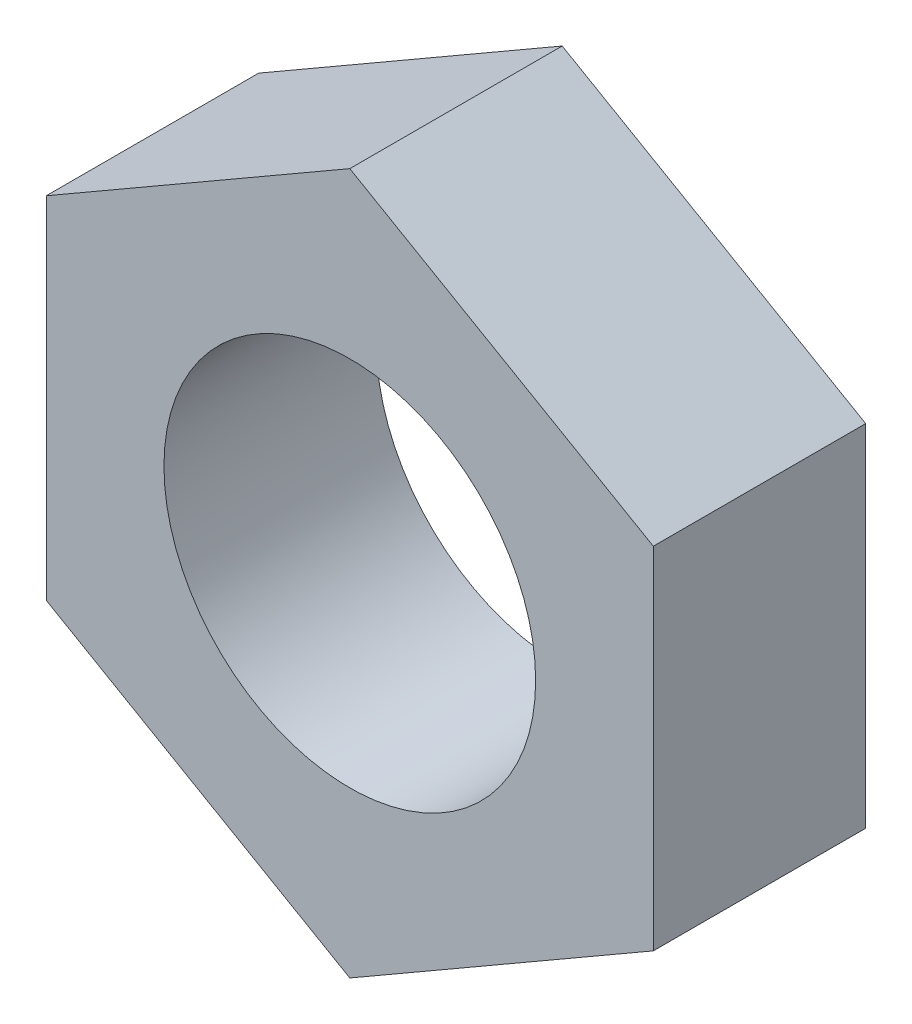
ISO-10303-21;
HEADER;
FILE_DESCRIPTION(('STEP AP214'),'2;1');
FILE_NAME('part.step','',(''),(''),'','','');
FILE_SCHEMA(('AUTOMOTIVE_DESIGN { 1 0 10303 214 1 1 1 1 }'));
ENDSEC;
DATA;
#1=APPLICATION_CONTEXT('core data for automotive mechanical design processes');
#2=APPLICATION_PROTOCOL_DEFINITION('international standard','automotive_design',2000,#1);
#3=PRODUCT_CONTEXT('',#1,'mechanical');
#4=PRODUCT('Part','Part','',(#3));
#5=PRODUCT_RELATED_PRODUCT_CATEGORY('part','',(#4));
#6=PRODUCT_DEFINITION_FORMATION('','',#4);
#7=PRODUCT_DEFINITION_CONTEXT('part definition',#1,'design');
#8=PRODUCT_DEFINITION('design','',#6,#7);
#9=PRODUCT_DEFINITION_SHAPE('','',#8);
#10=(LENGTH_UNIT() NAMED_UNIT(*) SI_UNIT(.MILLI.,.METRE.));
#11=(NAMED_UNIT(*) PLANE_ANGLE_UNIT() SI_UNIT($,.RADIAN.));
#12=(NAMED_UNIT(*) SI_UNIT($,.STERADIAN.) SOLID_ANGLE_UNIT());
#13=UNCERTAINTY_MEASURE_WITH_UNIT(LENGTH_MEASURE(1.E-05),#10,'distance_accuracy_value','');
#14=(GEOMETRIC_REPRESENTATION_CONTEXT(3) GLOBAL_UNCERTAINTY_ASSIGNED_CONTEXT((#13)) GLOBAL_UNIT_ASSIGNED_CONTEXT((#10,
#11,#12)) REPRESENTATION_CONTEXT('',''));
#15=CARTESIAN_POINT('',(0.,0.,0.));
#16=DIRECTION('',(0.,0.,1.));
#17=DIRECTION('',(1.,0.,0.));
#18=AXIS2_PLACEMENT_3D('',#15,#16,#17);
#19=CARTESIAN_POINT('',(1.42894191624432,2.475,2.));
#20=DIRECTION('',(-0.5,-0.866025403784439,0.));
#21=DIRECTION('',(0.866025403784439,-0.5,0.));
#22=AXIS2_PLACEMENT_3D('',#19,#20,#21);
#23=PLANE('',#22);
#24=DIRECTION('',(-0.866025403784439,0.5,0.));
#25=VECTOR('',#24,1.);
#26=CARTESIAN_POINT('',(1.42894191624432,2.475,0.));
#27=LINE('',#26,#25);
#28=CARTESIAN_POINT('',(2.85788383248865,1.65,0.));
#29=VERTEX_POINT('',#28);
#30=CARTESIAN_POINT('',(0.,3.3,0.));
#31=VERTEX_POINT('',#30);
#32=EDGE_CURVE('E139',#29,#31,#27,.T.);
#33=ORIENTED_EDGE('',*,*,#32,.T.);
#34=DIRECTION('',(0.,0.,-1.));
#35=VECTOR('',#34,1.);
#36=CARTESIAN_POINT('',(0.,3.3,2.));
#37=LINE('',#36,#35);
#38=CARTESIAN_POINT('',(0.,3.3,2.));
#39=VERTEX_POINT('',#38);
#40=EDGE_CURVE('E11',#39,#31,#37,.T.);
#41=ORIENTED_EDGE('',*,*,#40,.F.);
#42=DIRECTION('',(-0.866025403784439,0.5,0.));
#43=VECTOR('',#42,1.);
#44=CARTESIAN_POINT('',(1.42894191624432,2.475,2.));
#45=LINE('',#44,#43);
#46=CARTESIAN_POINT('',(2.85788383248865,1.65,2.));
#47=VERTEX_POINT('',#46);
#48=EDGE_CURVE('E159',#47,#39,#45,.T.);
#49=ORIENTED_EDGE('',*,*,#48,.F.);
#50=DIRECTION('',(0.,0.,-1.));
#51=VECTOR('',#50,1.);
#52=CARTESIAN_POINT('',(2.85788383248865,1.65,2.));
#53=LINE('',#52,#51);
#54=EDGE_CURVE('E138',#47,#29,#53,.T.);
#55=ORIENTED_EDGE('',*,*,#54,.T.);
#56=EDGE_LOOP('',(#33,#41,#49,#55));
#57=FACE_BOUND('',#56,.T.);
#58=ADVANCED_FACE('F45',(#57),#23,.F.);
#59=CARTESIAN_POINT('',(-1.42894191624432,2.475,2.));
#60=DIRECTION('',(0.5,-0.866025403784439,0.));
#61=DIRECTION('',(0.866025403784439,0.5,0.));
#62=AXIS2_PLACEMENT_3D('',#59,#60,#61);
#63=PLANE('',#62);
#64=DIRECTION('',(-0.866025403784439,-0.5,0.));
#65=VECTOR('',#64,1.);
#66=CARTESIAN_POINT('',(-1.42894191624432,2.475,0.));
#67=LINE('',#66,#65);
#68=CARTESIAN_POINT('',(-2.85788383248865,1.65,0.));
#69=VERTEX_POINT('',#68);
#70=EDGE_CURVE('E143',#31,#69,#67,.T.);
#71=ORIENTED_EDGE('',*,*,#70,.T.);
#72=DIRECTION('',(0.,0.,-1.));
#73=VECTOR('',#72,1.);
#74=CARTESIAN_POINT('',(-2.85788383248865,1.65,2.));
#75=LINE('',#74,#73);
#76=CARTESIAN_POINT('',(-2.85788383248865,1.65,2.));
#77=VERTEX_POINT('',#76);
#78=EDGE_CURVE('E54',#77,#69,#75,.T.);
#79=ORIENTED_EDGE('',*,*,#78,.F.);
#80=DIRECTION('',(-0.866025403784439,-0.5,0.));
#81=VECTOR('',#80,1.);
#82=CARTESIAN_POINT('',(-1.42894191624432,2.475,2.));
#83=LINE('',#82,#81);
#84=EDGE_CURVE('E99',#39,#77,#83,.T.);
#85=ORIENTED_EDGE('',*,*,#84,.F.);
#86=ORIENTED_EDGE('',*,*,#40,.T.);
#87=EDGE_LOOP('',(#71,#79,#85,#86));
#88=FACE_BOUND('',#87,.T.);
#89=ADVANCED_FACE('F189',(#88),#63,.F.);
#90=CARTESIAN_POINT('',(-2.85788383248865,0.,2.));
#91=DIRECTION('',(1.,0.,0.));
#92=DIRECTION('',(0.,1.,0.));
#93=AXIS2_PLACEMENT_3D('',#90,#91,#92);
#94=PLANE('',#93);
#95=DIRECTION('',(0.,-1.,0.));
#96=VECTOR('',#95,1.);
#97=CARTESIAN_POINT('',(-2.85788383248865,0.,0.));
#98=LINE('',#97,#96);
#99=CARTESIAN_POINT('',(-2.85788383248865,-1.65,0.));
#100=VERTEX_POINT('',#99);
#101=EDGE_CURVE('E146',#69,#100,#98,.T.);
#102=ORIENTED_EDGE('',*,*,#101,.T.);
#103=DIRECTION('',(0.,0.,-1.));
#104=VECTOR('',#103,1.);
#105=CARTESIAN_POINT('',(-2.85788383248865,-1.65,2.));
#106=LINE('',#105,#104);
#107=CARTESIAN_POINT('',(-2.85788383248865,-1.65,2.));
#108=VERTEX_POINT('',#107);
#109=EDGE_CURVE('E124',#108,#100,#106,.T.);
#110=ORIENTED_EDGE('',*,*,#109,.F.);
#111=DIRECTION('',(0.,-1.,0.));
#112=VECTOR('',#111,1.);
#113=CARTESIAN_POINT('',(-2.85788383248865,0.,2.));
#114=LINE('',#113,#112);
#115=EDGE_CURVE('E113',#77,#108,#114,.T.);
#116=ORIENTED_EDGE('',*,*,#115,.F.);
#117=ORIENTED_EDGE('',*,*,#78,.T.);
#118=EDGE_LOOP('',(#102,#110,#116,#117));
#119=FACE_BOUND('',#118,.T.);
#120=ADVANCED_FACE('F169',(#119),#94,.F.);
#121=CARTESIAN_POINT('',(-1.42894191624432,-2.475,2.));
#122=DIRECTION('',(0.5,0.866025403784439,0.));
#123=DIRECTION('',(-0.866025403784439,0.5,0.));
#124=AXIS2_PLACEMENT_3D('',#121,#122,#123);
#125=PLANE('',#124);
#126=DIRECTION('',(0.866025403784439,-0.5,0.));
#127=VECTOR('',#126,1.);
#128=CARTESIAN_POINT('',(-1.42894191624432,-2.475,0.));
#129=LINE('',#128,#127);
#130=CARTESIAN_POINT('',(0.,-3.3,0.));
#131=VERTEX_POINT('',#130);
#132=EDGE_CURVE('E122',#100,#131,#129,.T.);
#133=ORIENTED_EDGE('',*,*,#132,.T.);
#134=DIRECTION('',(0.,0.,-1.));
#135=VECTOR('',#134,1.);
#136=CARTESIAN_POINT('',(0.,-3.3,2.));
#137=LINE('',#136,#135);
#138=CARTESIAN_POINT('',(0.,-3.3,2.));
#139=VERTEX_POINT('',#138);
#140=EDGE_CURVE('E119',#139,#131,#137,.T.);
#141=ORIENTED_EDGE('',*,*,#140,.F.);
#142=DIRECTION('',(0.866025403784439,-0.5,0.));
#143=VECTOR('',#142,1.);
#144=CARTESIAN_POINT('',(-1.42894191624432,-2.475,2.));
#145=LINE('',#144,#143);
#146=EDGE_CURVE('E106',#108,#139,#145,.T.);
#147=ORIENTED_EDGE('',*,*,#146,.F.);
#148=ORIENTED_EDGE('',*,*,#109,.T.);
#149=EDGE_LOOP('',(#133,#141,#147,#148));
#150=FACE_BOUND('',#149,.T.);
#151=ADVANCED_FACE('F120',(#150),#125,.F.);
#152=CARTESIAN_POINT('',(1.42894191624432,-2.475,2.));
#153=DIRECTION('',(-0.5,0.866025403784439,0.));
#154=DIRECTION('',(-0.866025403784439,-0.5,0.));
#155=AXIS2_PLACEMENT_3D('',#152,#153,#154);
#156=PLANE('',#155);
#157=DIRECTION('',(0.866025403784439,0.5,0.));
#158=VECTOR('',#157,1.);
#159=CARTESIAN_POINT('',(1.42894191624432,-2.475,0.));
#160=LINE('',#159,#158);
#161=CARTESIAN_POINT('',(2.85788383248865,-1.65,0.));
#162=VERTEX_POINT('',#161);
#163=EDGE_CURVE('E85',#131,#162,#160,.T.);
#164=ORIENTED_EDGE('',*,*,#163,.T.);
#165=DIRECTION('',(0.,0.,-1.));
#166=VECTOR('',#165,1.);
#167=CARTESIAN_POINT('',(2.85788383248865,-1.65,2.));
#168=LINE('',#167,#166);
#169=CARTESIAN_POINT('',(2.85788383248865,-1.65,2.));
#170=VERTEX_POINT('',#169);
#171=EDGE_CURVE('E125',#170,#162,#168,.T.);
#172=ORIENTED_EDGE('',*,*,#171,.F.);
#173=DIRECTION('',(0.866025403784439,0.5,0.));
#174=VECTOR('',#173,1.);
#175=CARTESIAN_POINT('',(1.42894191624432,-2.475,2.));
#176=LINE('',#175,#174);
#177=EDGE_CURVE('E111',#139,#170,#176,.T.);
#178=ORIENTED_EDGE('',*,*,#177,.F.);
#179=ORIENTED_EDGE('',*,*,#140,.T.);
#180=EDGE_LOOP('',(#164,#172,#178,#179));
#181=FACE_BOUND('',#180,.T.);
#182=ADVANCED_FACE('F127',(#181),#156,.F.);
#183=CARTESIAN_POINT('',(2.85788383248865,0.,2.));
#184=DIRECTION('',(-1.,0.,0.));
#185=DIRECTION('',(0.,-1.,0.));
#186=AXIS2_PLACEMENT_3D('',#183,#184,#185);
#187=PLANE('',#186);
#188=DIRECTION('',(0.,1.,0.));
#189=VECTOR('',#188,1.);
#190=CARTESIAN_POINT('',(2.85788383248865,0.,0.));
#191=LINE('',#190,#189);
#192=EDGE_CURVE('E91',#162,#29,#191,.T.);
#193=ORIENTED_EDGE('',*,*,#192,.T.);
#194=ORIENTED_EDGE('',*,*,#54,.F.);
#195=DIRECTION('',(0.,1.,0.));
#196=VECTOR('',#195,1.);
#197=CARTESIAN_POINT('',(2.85788383248865,0.,2.));
#198=LINE('',#197,#196);
#199=EDGE_CURVE('E62',#170,#47,#198,.T.);
#200=ORIENTED_EDGE('',*,*,#199,.F.);
#201=ORIENTED_EDGE('',*,*,#171,.T.);
#202=EDGE_LOOP('',(#193,#194,#200,#201));
#203=FACE_BOUND('',#202,.T.);
#204=ADVANCED_FACE('F177',(#203),#187,.F.);
#205=CARTESIAN_POINT('',(0.,0.,2.));
#206=DIRECTION('',(0.,0.,-1.));
#207=DIRECTION('',(-1.,0.,0.));
#208=AXIS2_PLACEMENT_3D('',#205,#206,#207);
#209=CYLINDRICAL_SURFACE('',#208,1.75);
#210=CARTESIAN_POINT('',(0.,0.,2.));
#211=DIRECTION('',(0.,0.,1.));
#212=DIRECTION('',(1.,0.,0.));
#213=AXIS2_PLACEMENT_3D('',#210,#211,#212);
#214=CIRCLE('',#213,1.75);
#215=CARTESIAN_POINT('',(1.75,0.,2.));
#216=VERTEX_POINT('',#215);
#217=EDGE_CURVE('E131',#216,#216,#214,.T.);
#218=ORIENTED_EDGE('',*,*,#217,.T.);
#219=EDGE_LOOP('',(#218));
#220=FACE_BOUND('',#219,.T.);
#221=CARTESIAN_POINT('',(0.,0.,0.));
#222=DIRECTION('',(0.,0.,1.));
#223=DIRECTION('',(1.,0.,0.));
#224=AXIS2_PLACEMENT_3D('',#221,#222,#223);
#225=CIRCLE('',#224,1.75);
#226=CARTESIAN_POINT('',(1.75,0.,0.));
#227=VERTEX_POINT('',#226);
#228=EDGE_CURVE('E155',#227,#227,#225,.T.);
#229=ORIENTED_EDGE('',*,*,#228,.F.);
#230=EDGE_LOOP('',(#229));
#231=FACE_BOUND('',#230,.T.);
#232=ADVANCED_FACE('F179',(#220,#231),#209,.F.);
#233=CARTESIAN_POINT('',(0.,0.,2.));
#234=DIRECTION('',(0.,0.,1.));
#235=DIRECTION('',(1.,0.,0.));
#236=AXIS2_PLACEMENT_3D('',#233,#234,#235);
#237=PLANE('',#236);
#238=ORIENTED_EDGE('',*,*,#48,.T.);
#239=ORIENTED_EDGE('',*,*,#84,.T.);
#240=ORIENTED_EDGE('',*,*,#115,.T.);
#241=ORIENTED_EDGE('',*,*,#146,.T.);
#242=ORIENTED_EDGE('',*,*,#177,.T.);
#243=ORIENTED_EDGE('',*,*,#199,.T.);
#244=EDGE_LOOP('',(#238,#239,#240,#241,#242,#243));
#245=FACE_BOUND('',#244,.T.);
#246=ORIENTED_EDGE('',*,*,#217,.F.);
#247=EDGE_LOOP('',(#246));
#248=FACE_BOUND('',#247,.T.);
#249=ADVANCED_FACE('F108',(#245,#248),#237,.T.);
#250=CARTESIAN_POINT('',(0.,0.,0.));
#251=DIRECTION('',(0.,0.,1.));
#252=DIRECTION('',(1.,0.,0.));
#253=AXIS2_PLACEMENT_3D('',#250,#251,#252);
#254=PLANE('',#253);
#255=ORIENTED_EDGE('',*,*,#32,.F.);
#256=ORIENTED_EDGE('',*,*,#192,.F.);
#257=ORIENTED_EDGE('',*,*,#163,.F.);
#258=ORIENTED_EDGE('',*,*,#132,.F.);
#259=ORIENTED_EDGE('',*,*,#101,.F.);
#260=ORIENTED_EDGE('',*,*,#70,.F.);
#261=EDGE_LOOP('',(#255,#256,#257,#258,#259,#260));
#262=FACE_BOUND('',#261,.T.);
#263=ORIENTED_EDGE('',*,*,#228,.T.);
#264=EDGE_LOOP('',(#263));
#265=FACE_BOUND('',#264,.T.);
#266=ADVANCED_FACE('F172',(#262,#265),#254,.F.);
#267=CLOSED_SHELL('',(#58,#89,#120,#151,#182,#204,#232,#249,#266));
#268=MANIFOLD_SOLID_BREP('B2',#267);
#269=ADVANCED_BREP_SHAPE_REPRESENTATION('',(#18,#268),#14);
#270=SHAPE_DEFINITION_REPRESENTATION(#9,#269);
ENDSEC;
END-ISO-10303-21;
